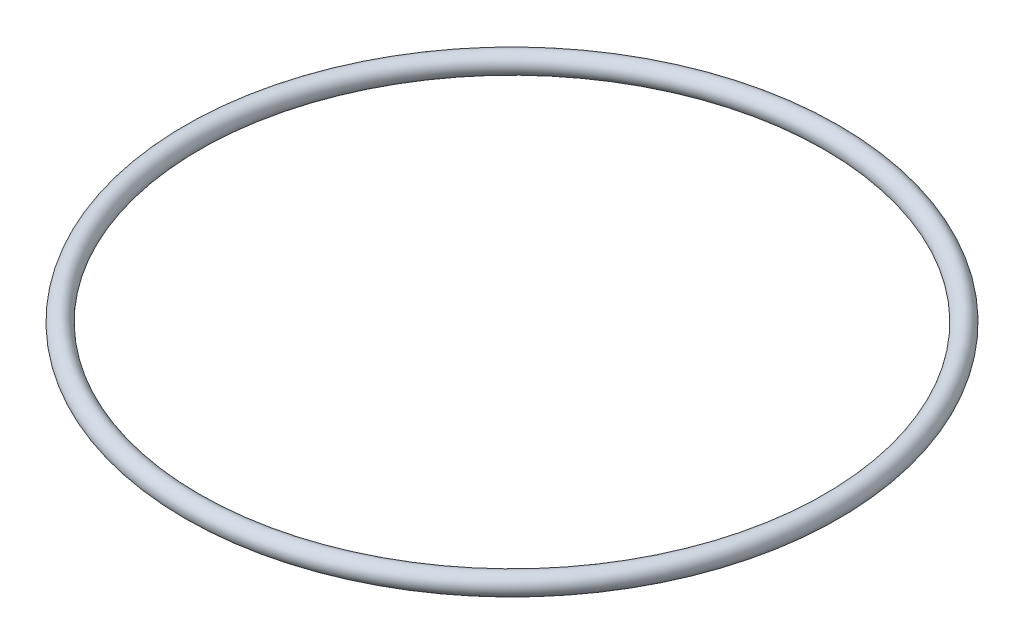
ISO-10303-21;
HEADER;
FILE_DESCRIPTION(('STEP AP214'),'2;1');
FILE_NAME('part.step','',(''),(''),'','','');
FILE_SCHEMA(('AUTOMOTIVE_DESIGN { 1 0 10303 214 1 1 1 1 }'));
ENDSEC;
DATA;
#1=APPLICATION_CONTEXT('core data for automotive mechanical design processes');
#2=APPLICATION_PROTOCOL_DEFINITION('international standard','automotive_design',2000,#1);
#3=PRODUCT_CONTEXT('',#1,'mechanical');
#4=PRODUCT('Part','Part','',(#3));
#5=PRODUCT_RELATED_PRODUCT_CATEGORY('part','',(#4));
#6=PRODUCT_DEFINITION_FORMATION('','',#4);
#7=PRODUCT_DEFINITION_CONTEXT('part definition',#1,'design');
#8=PRODUCT_DEFINITION('design','',#6,#7);
#9=PRODUCT_DEFINITION_SHAPE('','',#8);
#10=(LENGTH_UNIT() NAMED_UNIT(*) SI_UNIT(.MILLI.,.METRE.));
#11=(NAMED_UNIT(*) PLANE_ANGLE_UNIT() SI_UNIT($,.RADIAN.));
#12=(NAMED_UNIT(*) SI_UNIT($,.STERADIAN.) SOLID_ANGLE_UNIT());
#13=UNCERTAINTY_MEASURE_WITH_UNIT(LENGTH_MEASURE(1.E-05),#10,'distance_accuracy_value','');
#14=(GEOMETRIC_REPRESENTATION_CONTEXT(3) GLOBAL_UNCERTAINTY_ASSIGNED_CONTEXT((#13)) GLOBAL_UNIT_ASSIGNED_CONTEXT((#10,
#11,#12)) REPRESENTATION_CONTEXT('',''));
#15=CARTESIAN_POINT('',(0.,0.,0.));
#16=DIRECTION('',(0.,0.,1.));
#17=DIRECTION('',(1.,0.,0.));
#18=AXIS2_PLACEMENT_3D('',#15,#16,#17);
#19=CARTESIAN_POINT('',(0.,0.,0.));
#20=DIRECTION('',(0.,-1.,0.));
#21=DIRECTION('',(0.,0.,-1.));
#22=AXIS2_PLACEMENT_3D('',#19,#20,#21);
#23=TOROIDAL_SURFACE('',#22,32.,1.);
#24=CARTESIAN_POINT('',(0.,0.,-33.));
#25=VERTEX_POINT('',#24);
#26=VERTEX_LOOP('',#25);
#27=FACE_BOUND('',#26,.T.);
#28=ADVANCED_FACE('F33',(#27),#23,.T.);
#29=CLOSED_SHELL('',(#28));
#30=MANIFOLD_SOLID_BREP('B2',#29);
#31=ADVANCED_BREP_SHAPE_REPRESENTATION('',(#18,#30),#14);
#32=SHAPE_DEFINITION_REPRESENTATION(#9,#31);
ENDSEC;
END-ISO-10303-21;
